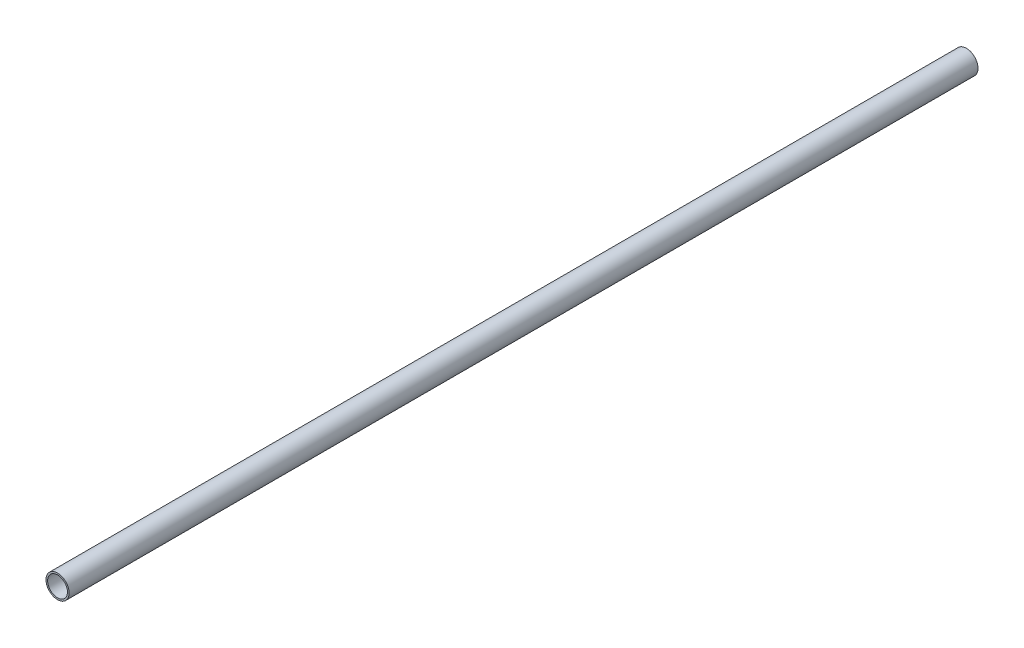
ISO-10303-21;
HEADER;
FILE_DESCRIPTION(('STEP AP214'),'2;1');
FILE_NAME('part.step','',(''),(''),'','','');
FILE_SCHEMA(('AUTOMOTIVE_DESIGN { 1 0 10303 214 1 1 1 1 }'));
ENDSEC;
DATA;
#1=APPLICATION_CONTEXT('core data for automotive mechanical design processes');
#2=APPLICATION_PROTOCOL_DEFINITION('international standard','automotive_design',2000,#1);
#3=PRODUCT_CONTEXT('',#1,'mechanical');
#4=PRODUCT('Part','Part','',(#3));
#5=PRODUCT_RELATED_PRODUCT_CATEGORY('part','',(#4));
#6=PRODUCT_DEFINITION_FORMATION('','',#4);
#7=PRODUCT_DEFINITION_CONTEXT('part definition',#1,'design');
#8=PRODUCT_DEFINITION('design','',#6,#7);
#9=PRODUCT_DEFINITION_SHAPE('','',#8);
#10=(LENGTH_UNIT() NAMED_UNIT(*) SI_UNIT(.MILLI.,.METRE.));
#11=(NAMED_UNIT(*) PLANE_ANGLE_UNIT() SI_UNIT($,.RADIAN.));
#12=(NAMED_UNIT(*) SI_UNIT($,.STERADIAN.) SOLID_ANGLE_UNIT());
#13=UNCERTAINTY_MEASURE_WITH_UNIT(LENGTH_MEASURE(1.E-05),#10,'distance_accuracy_value','');
#14=(GEOMETRIC_REPRESENTATION_CONTEXT(3) GLOBAL_UNCERTAINTY_ASSIGNED_CONTEXT((#13)) GLOBAL_UNIT_ASSIGNED_CONTEXT((#10,
#11,#12)) REPRESENTATION_CONTEXT('',''));
#15=CARTESIAN_POINT('',(0.,0.,0.));
#16=DIRECTION('',(0.,0.,1.));
#17=DIRECTION('',(1.,0.,0.));
#18=AXIS2_PLACEMENT_3D('',#15,#16,#17);
#19=CARTESIAN_POINT('',(0.,0.,550.));
#20=DIRECTION('',(0.,0.,1.));
#21=DIRECTION('',(1.,0.,0.));
#22=AXIS2_PLACEMENT_3D('',#19,#20,#21);
#23=PLANE('',#22);
#24=CARTESIAN_POINT('',(0.,0.,550.));
#25=DIRECTION('',(0.,0.,1.));
#26=DIRECTION('',(1.,0.,0.));
#27=AXIS2_PLACEMENT_3D('',#24,#25,#26);
#28=CIRCLE('',#27,7.);
#29=CARTESIAN_POINT('',(7.,0.,550.));
#30=VERTEX_POINT('',#29);
#31=EDGE_CURVE('E10',#30,#30,#28,.T.);
#32=ORIENTED_EDGE('',*,*,#31,.T.);
#33=EDGE_LOOP('',(#32));
#34=FACE_BOUND('',#33,.T.);
#35=CARTESIAN_POINT('',(0.,0.,550.));
#36=DIRECTION('',(0.,0.,1.));
#37=DIRECTION('',(1.,0.,0.));
#38=AXIS2_PLACEMENT_3D('',#35,#36,#37);
#39=CIRCLE('',#38,6.);
#40=CARTESIAN_POINT('',(6.,0.,550.));
#41=VERTEX_POINT('',#40);
#42=EDGE_CURVE('E48',#41,#41,#39,.T.);
#43=ORIENTED_EDGE('',*,*,#42,.F.);
#44=EDGE_LOOP('',(#43));
#45=FACE_BOUND('',#44,.T.);
#46=ADVANCED_FACE('F37',(#34,#45),#23,.T.);
#47=CARTESIAN_POINT('',(0.,0.,0.));
#48=DIRECTION('',(0.,0.,1.));
#49=DIRECTION('',(1.,0.,0.));
#50=AXIS2_PLACEMENT_3D('',#47,#48,#49);
#51=PLANE('',#50);
#52=CARTESIAN_POINT('',(0.,0.,0.));
#53=DIRECTION('',(0.,0.,1.));
#54=DIRECTION('',(1.,0.,0.));
#55=AXIS2_PLACEMENT_3D('',#52,#53,#54);
#56=CIRCLE('',#55,7.);
#57=CARTESIAN_POINT('',(7.,0.,0.));
#58=VERTEX_POINT('',#57);
#59=EDGE_CURVE('E41',#58,#58,#56,.T.);
#60=ORIENTED_EDGE('',*,*,#59,.F.);
#61=EDGE_LOOP('',(#60));
#62=FACE_BOUND('',#61,.T.);
#63=CARTESIAN_POINT('',(0.,0.,0.));
#64=DIRECTION('',(0.,0.,1.));
#65=DIRECTION('',(1.,0.,0.));
#66=AXIS2_PLACEMENT_3D('',#63,#64,#65);
#67=CIRCLE('',#66,6.);
#68=CARTESIAN_POINT('',(6.,0.,0.));
#69=VERTEX_POINT('',#68);
#70=EDGE_CURVE('E50',#69,#69,#67,.T.);
#71=ORIENTED_EDGE('',*,*,#70,.T.);
#72=EDGE_LOOP('',(#71));
#73=FACE_BOUND('',#72,.T.);
#74=ADVANCED_FACE('F60',(#62,#73),#51,.F.);
#75=CARTESIAN_POINT('',(0.,0.,550.));
#76=DIRECTION('',(0.,0.,-1.));
#77=DIRECTION('',(-1.,0.,0.));
#78=AXIS2_PLACEMENT_3D('',#75,#76,#77);
#79=CYLINDRICAL_SURFACE('',#78,7.);
#80=ORIENTED_EDGE('',*,*,#31,.F.);
#81=EDGE_LOOP('',(#80));
#82=FACE_BOUND('',#81,.T.);
#83=ORIENTED_EDGE('',*,*,#59,.T.);
#84=EDGE_LOOP('',(#83));
#85=FACE_BOUND('',#84,.T.);
#86=ADVANCED_FACE('F39',(#82,#85),#79,.T.);
#87=CARTESIAN_POINT('',(0.,0.,550.));
#88=DIRECTION('',(0.,0.,-1.));
#89=DIRECTION('',(-1.,0.,0.));
#90=AXIS2_PLACEMENT_3D('',#87,#88,#89);
#91=CYLINDRICAL_SURFACE('',#90,6.);
#92=ORIENTED_EDGE('',*,*,#42,.T.);
#93=EDGE_LOOP('',(#92));
#94=FACE_BOUND('',#93,.T.);
#95=ORIENTED_EDGE('',*,*,#70,.F.);
#96=EDGE_LOOP('',(#95));
#97=FACE_BOUND('',#96,.T.);
#98=ADVANCED_FACE('F56',(#94,#97),#91,.F.);
#99=CLOSED_SHELL('',(#46,#74,#86,#98));
#100=MANIFOLD_SOLID_BREP('B2',#99);
#101=ADVANCED_BREP_SHAPE_REPRESENTATION('',(#18,#100),#14);
#102=SHAPE_DEFINITION_REPRESENTATION(#9,#101);
ENDSEC;
END-ISO-10303-21;
